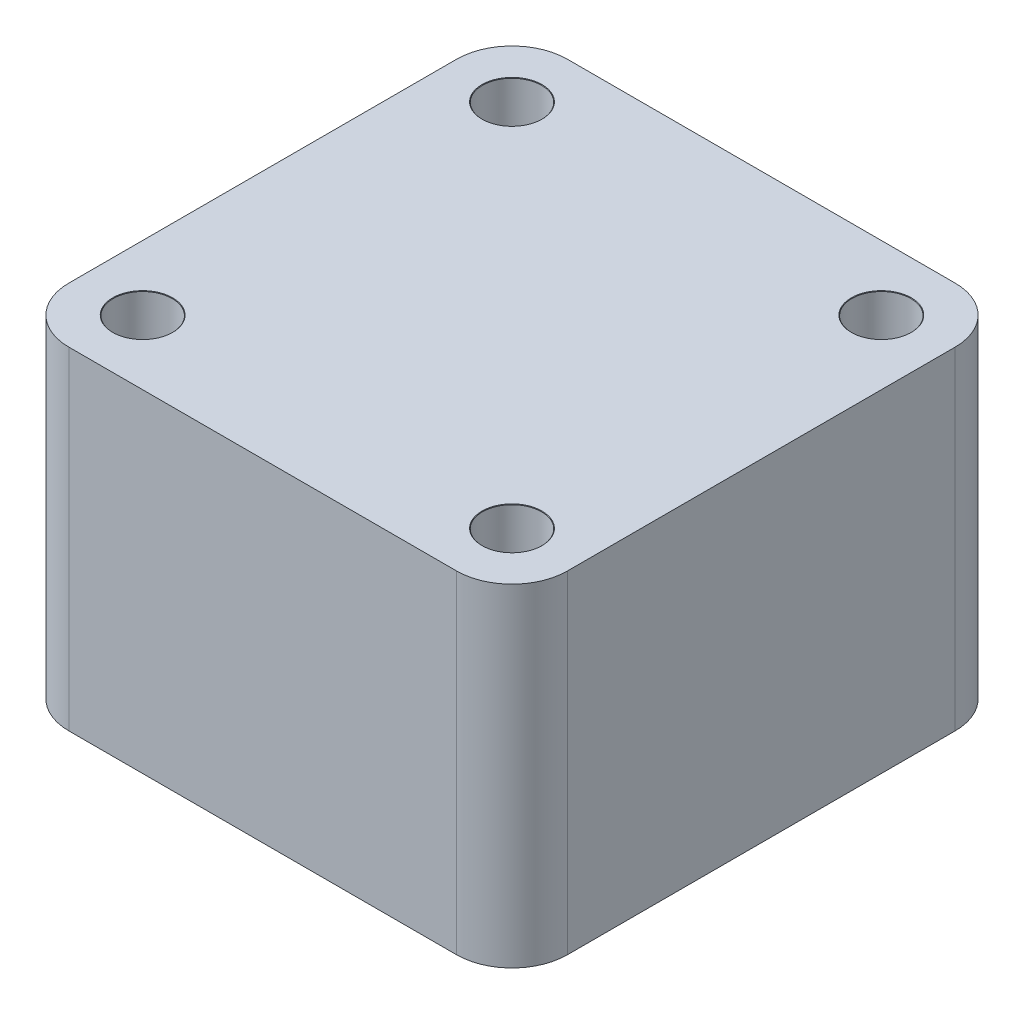
ISO-10303-21;
HEADER;
FILE_DESCRIPTION(('STEP AP214'),'2;1');
FILE_NAME('part.step','',(''),(''),'','','');
FILE_SCHEMA(('AUTOMOTIVE_DESIGN { 1 0 10303 214 1 1 1 1 }'));
ENDSEC;
DATA;
#1=APPLICATION_CONTEXT('core data for automotive mechanical design processes');
#2=APPLICATION_PROTOCOL_DEFINITION('international standard','automotive_design',2000,#1);
#3=PRODUCT_CONTEXT('',#1,'mechanical');
#4=PRODUCT('Part','Part','',(#3));
#5=PRODUCT_RELATED_PRODUCT_CATEGORY('part','',(#4));
#6=PRODUCT_DEFINITION_FORMATION('','',#4);
#7=PRODUCT_DEFINITION_CONTEXT('part definition',#1,'design');
#8=PRODUCT_DEFINITION('design','',#6,#7);
#9=PRODUCT_DEFINITION_SHAPE('','',#8);
#10=(LENGTH_UNIT() NAMED_UNIT(*) SI_UNIT(.MILLI.,.METRE.));
#11=(NAMED_UNIT(*) PLANE_ANGLE_UNIT() SI_UNIT($,.RADIAN.));
#12=(NAMED_UNIT(*) SI_UNIT($,.STERADIAN.) SOLID_ANGLE_UNIT());
#13=UNCERTAINTY_MEASURE_WITH_UNIT(LENGTH_MEASURE(1.E-05),#10,'distance_accuracy_value','');
#14=(GEOMETRIC_REPRESENTATION_CONTEXT(3) GLOBAL_UNCERTAINTY_ASSIGNED_CONTEXT((#13)) GLOBAL_UNIT_ASSIGNED_CONTEXT((#10,
#11,#12)) REPRESENTATION_CONTEXT('',''));
#15=CARTESIAN_POINT('',(0.,0.,0.));
#16=DIRECTION('',(0.,0.,1.));
#17=DIRECTION('',(1.,0.,0.));
#18=AXIS2_PLACEMENT_3D('',#15,#16,#17);
#19=CARTESIAN_POINT('',(-13.5,18.,13.5));
#20=DIRECTION('',(1.,0.,0.));
#21=DIRECTION('',(0.,0.,-1.));
#22=AXIS2_PLACEMENT_3D('',#19,#20,#21);
#23=PLANE('',#22);
#24=DIRECTION('',(0.,0.,1.));
#25=VECTOR('',#24,1.);
#26=CARTESIAN_POINT('',(-13.5,0.,13.5));
#27=LINE('',#26,#25);
#28=CARTESIAN_POINT('',(-13.5,0.,-10.5));
#29=VERTEX_POINT('',#28);
#30=CARTESIAN_POINT('',(-13.5,0.,10.5));
#31=VERTEX_POINT('',#30);
#32=EDGE_CURVE('E142',#29,#31,#27,.T.);
#33=ORIENTED_EDGE('',*,*,#32,.T.);
#34=DIRECTION('',(0.,-1.,0.));
#35=VECTOR('',#34,1.);
#36=CARTESIAN_POINT('',(-13.5,18.,10.5));
#37=LINE('',#36,#35);
#38=CARTESIAN_POINT('',(-13.5,18.,10.5));
#39=VERTEX_POINT('',#38);
#40=EDGE_CURVE('E175',#31,#39,#37,.F.);
#41=ORIENTED_EDGE('',*,*,#40,.T.);
#42=DIRECTION('',(0.,0.,1.));
#43=VECTOR('',#42,1.);
#44=CARTESIAN_POINT('',(-13.5,18.,13.5));
#45=LINE('',#44,#43);
#46=CARTESIAN_POINT('',(-13.5,18.,-10.5));
#47=VERTEX_POINT('',#46);
#48=EDGE_CURVE('E140',#47,#39,#45,.T.);
#49=ORIENTED_EDGE('',*,*,#48,.F.);
#50=DIRECTION('',(0.,-1.,0.));
#51=VECTOR('',#50,1.);
#52=CARTESIAN_POINT('',(-13.5,18.,-10.5));
#53=LINE('',#52,#51);
#54=EDGE_CURVE('E171',#47,#29,#53,.T.);
#55=ORIENTED_EDGE('',*,*,#54,.T.);
#56=EDGE_LOOP('',(#33,#41,#49,#55));
#57=FACE_BOUND('',#56,.T.);
#58=ADVANCED_FACE('F39',(#57),#23,.F.);
#59=CARTESIAN_POINT('',(13.5,18.,13.5));
#60=DIRECTION('',(0.,0.,-1.));
#61=DIRECTION('',(-1.,0.,0.));
#62=AXIS2_PLACEMENT_3D('',#59,#60,#61);
#63=PLANE('',#62);
#64=DIRECTION('',(1.,0.,0.));
#65=VECTOR('',#64,1.);
#66=CARTESIAN_POINT('',(13.5,0.,13.5));
#67=LINE('',#66,#65);
#68=CARTESIAN_POINT('',(-10.5,0.,13.5));
#69=VERTEX_POINT('',#68);
#70=CARTESIAN_POINT('',(10.5,0.,13.5));
#71=VERTEX_POINT('',#70);
#72=EDGE_CURVE('E136',#69,#71,#67,.T.);
#73=ORIENTED_EDGE('',*,*,#72,.T.);
#74=DIRECTION('',(0.,-1.,0.));
#75=VECTOR('',#74,1.);
#76=CARTESIAN_POINT('',(10.5,18.,13.5));
#77=LINE('',#76,#75);
#78=CARTESIAN_POINT('',(10.5,18.,13.5));
#79=VERTEX_POINT('',#78);
#80=EDGE_CURVE('E111',#71,#79,#77,.F.);
#81=ORIENTED_EDGE('',*,*,#80,.T.);
#82=DIRECTION('',(1.,0.,0.));
#83=VECTOR('',#82,1.);
#84=CARTESIAN_POINT('',(13.5,18.,13.5));
#85=LINE('',#84,#83);
#86=CARTESIAN_POINT('',(-10.5,18.,13.5));
#87=VERTEX_POINT('',#86);
#88=EDGE_CURVE('E182',#87,#79,#85,.T.);
#89=ORIENTED_EDGE('',*,*,#88,.F.);
#90=DIRECTION('',(0.,-1.,0.));
#91=VECTOR('',#90,1.);
#92=CARTESIAN_POINT('',(-10.5,18.,13.5));
#93=LINE('',#92,#91);
#94=EDGE_CURVE('E117',#87,#69,#93,.T.);
#95=ORIENTED_EDGE('',*,*,#94,.T.);
#96=EDGE_LOOP('',(#73,#81,#89,#95));
#97=FACE_BOUND('',#96,.T.);
#98=ADVANCED_FACE('F314',(#97),#63,.F.);
#99=CARTESIAN_POINT('',(13.5,18.,13.5));
#100=DIRECTION('',(-1.,0.,0.));
#101=DIRECTION('',(0.,0.,1.));
#102=AXIS2_PLACEMENT_3D('',#99,#100,#101);
#103=PLANE('',#102);
#104=DIRECTION('',(0.,0.,-1.));
#105=VECTOR('',#104,1.);
#106=CARTESIAN_POINT('',(13.5,18.,13.5));
#107=LINE('',#106,#105);
#108=CARTESIAN_POINT('',(13.5,18.,10.5));
#109=VERTEX_POINT('',#108);
#110=CARTESIAN_POINT('',(13.5,18.,-10.5));
#111=VERTEX_POINT('',#110);
#112=EDGE_CURVE('E126',#109,#111,#107,.T.);
#113=ORIENTED_EDGE('',*,*,#112,.F.);
#114=DIRECTION('',(0.,-1.,0.));
#115=VECTOR('',#114,1.);
#116=CARTESIAN_POINT('',(13.5,18.,10.5));
#117=LINE('',#116,#115);
#118=CARTESIAN_POINT('',(13.5,0.,10.5));
#119=VERTEX_POINT('',#118);
#120=EDGE_CURVE('E110',#109,#119,#117,.T.);
#121=ORIENTED_EDGE('',*,*,#120,.T.);
#122=DIRECTION('',(0.,0.,-1.));
#123=VECTOR('',#122,1.);
#124=CARTESIAN_POINT('',(13.5,0.,13.5));
#125=LINE('',#124,#123);
#126=CARTESIAN_POINT('',(13.5,0.,-10.5));
#127=VERTEX_POINT('',#126);
#128=EDGE_CURVE('E124',#119,#127,#125,.T.);
#129=ORIENTED_EDGE('',*,*,#128,.T.);
#130=DIRECTION('',(0.,-1.,0.));
#131=VECTOR('',#130,1.);
#132=CARTESIAN_POINT('',(13.5,18.,-10.5));
#133=LINE('',#132,#131);
#134=EDGE_CURVE('E129',#127,#111,#133,.F.);
#135=ORIENTED_EDGE('',*,*,#134,.T.);
#136=EDGE_LOOP('',(#113,#121,#129,#135));
#137=FACE_BOUND('',#136,.T.);
#138=ADVANCED_FACE('F123',(#137),#103,.F.);
#139=CARTESIAN_POINT('',(13.5,18.,-13.5));
#140=DIRECTION('',(0.,0.,1.));
#141=DIRECTION('',(1.,0.,0.));
#142=AXIS2_PLACEMENT_3D('',#139,#140,#141);
#143=PLANE('',#142);
#144=DIRECTION('',(-1.,0.,0.));
#145=VECTOR('',#144,1.);
#146=CARTESIAN_POINT('',(13.5,18.,-13.5));
#147=LINE('',#146,#145);
#148=CARTESIAN_POINT('',(10.5,18.,-13.5));
#149=VERTEX_POINT('',#148);
#150=CARTESIAN_POINT('',(-10.5,18.,-13.5));
#151=VERTEX_POINT('',#150);
#152=EDGE_CURVE('E147',#149,#151,#147,.T.);
#153=ORIENTED_EDGE('',*,*,#152,.F.);
#154=DIRECTION('',(0.,-1.,0.));
#155=VECTOR('',#154,1.);
#156=CARTESIAN_POINT('',(10.5,18.,-13.5));
#157=LINE('',#156,#155);
#158=CARTESIAN_POINT('',(10.5,0.,-13.5));
#159=VERTEX_POINT('',#158);
#160=EDGE_CURVE('E11',#149,#159,#157,.T.);
#161=ORIENTED_EDGE('',*,*,#160,.T.);
#162=DIRECTION('',(-1.,0.,0.));
#163=VECTOR('',#162,1.);
#164=CARTESIAN_POINT('',(13.5,0.,-13.5));
#165=LINE('',#164,#163);
#166=CARTESIAN_POINT('',(-10.5,0.,-13.5));
#167=VERTEX_POINT('',#166);
#168=EDGE_CURVE('E135',#159,#167,#165,.T.);
#169=ORIENTED_EDGE('',*,*,#168,.T.);
#170=DIRECTION('',(0.,-1.,0.));
#171=VECTOR('',#170,1.);
#172=CARTESIAN_POINT('',(-10.5,18.,-13.5));
#173=LINE('',#172,#171);
#174=EDGE_CURVE('E48',#167,#151,#173,.F.);
#175=ORIENTED_EDGE('',*,*,#174,.T.);
#176=EDGE_LOOP('',(#153,#161,#169,#175));
#177=FACE_BOUND('',#176,.T.);
#178=ADVANCED_FACE('F336',(#177),#143,.F.);
#179=CARTESIAN_POINT('',(0.,18.,0.));
#180=DIRECTION('',(0.,1.,0.));
#181=DIRECTION('',(0.,0.,1.));
#182=AXIS2_PLACEMENT_3D('',#179,#180,#181);
#183=PLANE('',#182);
#184=CARTESIAN_POINT('',(10.,18.,-10.));
#185=DIRECTION('',(0.,-1.,0.));
#186=DIRECTION('',(0.,0.,-1.));
#187=AXIS2_PLACEMENT_3D('',#184,#185,#186);
#188=CIRCLE('',#187,1.625);
#189=CARTESIAN_POINT('',(10.,18.,-11.625));
#190=VERTEX_POINT('',#189);
#191=EDGE_CURVE('E261',#190,#190,#188,.T.);
#192=ORIENTED_EDGE('',*,*,#191,.T.);
#193=EDGE_LOOP('',(#192));
#194=FACE_BOUND('',#193,.T.);
#195=CARTESIAN_POINT('',(-10.,18.,-10.));
#196=DIRECTION('',(0.,-1.,0.));
#197=DIRECTION('',(0.,0.,-1.));
#198=AXIS2_PLACEMENT_3D('',#195,#196,#197);
#199=CIRCLE('',#198,1.625);
#200=CARTESIAN_POINT('',(-10.,18.,-11.625));
#201=VERTEX_POINT('',#200);
#202=EDGE_CURVE('E245',#201,#201,#199,.T.);
#203=ORIENTED_EDGE('',*,*,#202,.T.);
#204=EDGE_LOOP('',(#203));
#205=FACE_BOUND('',#204,.T.);
#206=CARTESIAN_POINT('',(-10.,18.,10.));
#207=DIRECTION('',(0.,-1.,0.));
#208=DIRECTION('',(0.,0.,-1.));
#209=AXIS2_PLACEMENT_3D('',#206,#207,#208);
#210=CIRCLE('',#209,1.625);
#211=CARTESIAN_POINT('',(-10.,18.,8.375));
#212=VERTEX_POINT('',#211);
#213=EDGE_CURVE('E229',#212,#212,#210,.T.);
#214=ORIENTED_EDGE('',*,*,#213,.T.);
#215=EDGE_LOOP('',(#214));
#216=FACE_BOUND('',#215,.T.);
#217=CARTESIAN_POINT('',(10.,18.,10.));
#218=DIRECTION('',(0.,-1.,0.));
#219=DIRECTION('',(0.,0.,-1.));
#220=AXIS2_PLACEMENT_3D('',#217,#218,#219);
#221=CIRCLE('',#220,1.625);
#222=CARTESIAN_POINT('',(10.,18.,8.375));
#223=VERTEX_POINT('',#222);
#224=EDGE_CURVE('E211',#223,#223,#221,.T.);
#225=ORIENTED_EDGE('',*,*,#224,.T.);
#226=EDGE_LOOP('',(#225));
#227=FACE_BOUND('',#226,.T.);
#228=ORIENTED_EDGE('',*,*,#88,.T.);
#229=CARTESIAN_POINT('',(10.5,18.,10.5));
#230=DIRECTION('',(0.,1.,0.));
#231=DIRECTION('',(0.,0.,1.));
#232=AXIS2_PLACEMENT_3D('',#229,#230,#231);
#233=CIRCLE('',#232,3.);
#234=EDGE_CURVE('E168',#79,#109,#233,.T.);
#235=ORIENTED_EDGE('',*,*,#234,.T.);
#236=ORIENTED_EDGE('',*,*,#112,.T.);
#237=CARTESIAN_POINT('',(10.5,18.,-10.5));
#238=DIRECTION('',(0.,1.,0.));
#239=DIRECTION('',(0.,0.,1.));
#240=AXIS2_PLACEMENT_3D('',#237,#238,#239);
#241=CIRCLE('',#240,3.);
#242=EDGE_CURVE('E61',#111,#149,#241,.T.);
#243=ORIENTED_EDGE('',*,*,#242,.T.);
#244=ORIENTED_EDGE('',*,*,#152,.T.);
#245=CARTESIAN_POINT('',(-10.5,18.,-10.5));
#246=DIRECTION('',(0.,1.,0.));
#247=DIRECTION('',(0.,0.,1.));
#248=AXIS2_PLACEMENT_3D('',#245,#246,#247);
#249=CIRCLE('',#248,3.);
#250=EDGE_CURVE('E160',#151,#47,#249,.T.);
#251=ORIENTED_EDGE('',*,*,#250,.T.);
#252=ORIENTED_EDGE('',*,*,#48,.T.);
#253=CARTESIAN_POINT('',(-10.5,18.,10.5));
#254=DIRECTION('',(0.,1.,0.));
#255=DIRECTION('',(0.,0.,1.));
#256=AXIS2_PLACEMENT_3D('',#253,#254,#255);
#257=CIRCLE('',#256,3.);
#258=EDGE_CURVE('E165',#39,#87,#257,.T.);
#259=ORIENTED_EDGE('',*,*,#258,.T.);
#260=EDGE_LOOP('',(#228,#235,#236,#243,#244,#251,#252,#259));
#261=FACE_BOUND('',#260,.T.);
#262=ADVANCED_FACE('F266',(#194,#205,#216,#227,#261),#183,.T.);
#263=CARTESIAN_POINT('',(0.,0.,0.));
#264=DIRECTION('',(0.,1.,0.));
#265=DIRECTION('',(0.,0.,1.));
#266=AXIS2_PLACEMENT_3D('',#263,#264,#265);
#267=PLANE('',#266);
#268=CARTESIAN_POINT('',(10.,0.,-10.));
#269=DIRECTION('',(0.,-1.,0.));
#270=DIRECTION('',(0.,0.,-1.));
#271=AXIS2_PLACEMENT_3D('',#268,#269,#270);
#272=CIRCLE('',#271,1.625);
#273=CARTESIAN_POINT('',(10.,0.,-11.625));
#274=VERTEX_POINT('',#273);
#275=EDGE_CURVE('E257',#274,#274,#272,.T.);
#276=ORIENTED_EDGE('',*,*,#275,.F.);
#277=EDGE_LOOP('',(#276));
#278=FACE_BOUND('',#277,.T.);
#279=CARTESIAN_POINT('',(-10.,0.,-10.));
#280=DIRECTION('',(0.,-1.,0.));
#281=DIRECTION('',(0.,0.,-1.));
#282=AXIS2_PLACEMENT_3D('',#279,#280,#281);
#283=CIRCLE('',#282,1.625);
#284=CARTESIAN_POINT('',(-10.,0.,-11.625));
#285=VERTEX_POINT('',#284);
#286=EDGE_CURVE('E241',#285,#285,#283,.T.);
#287=ORIENTED_EDGE('',*,*,#286,.F.);
#288=EDGE_LOOP('',(#287));
#289=FACE_BOUND('',#288,.T.);
#290=CARTESIAN_POINT('',(-10.,0.,10.));
#291=DIRECTION('',(0.,-1.,0.));
#292=DIRECTION('',(0.,0.,-1.));
#293=AXIS2_PLACEMENT_3D('',#290,#291,#292);
#294=CIRCLE('',#293,1.625);
#295=CARTESIAN_POINT('',(-10.,0.,8.375));
#296=VERTEX_POINT('',#295);
#297=EDGE_CURVE('E225',#296,#296,#294,.T.);
#298=ORIENTED_EDGE('',*,*,#297,.F.);
#299=EDGE_LOOP('',(#298));
#300=FACE_BOUND('',#299,.T.);
#301=CARTESIAN_POINT('',(10.,0.,10.));
#302=DIRECTION('',(0.,-1.,0.));
#303=DIRECTION('',(0.,0.,-1.));
#304=AXIS2_PLACEMENT_3D('',#301,#302,#303);
#305=CIRCLE('',#304,1.625);
#306=CARTESIAN_POINT('',(10.,0.,8.375));
#307=VERTEX_POINT('',#306);
#308=EDGE_CURVE('E206',#307,#307,#305,.T.);
#309=ORIENTED_EDGE('',*,*,#308,.F.);
#310=EDGE_LOOP('',(#309));
#311=FACE_BOUND('',#310,.T.);
#312=ORIENTED_EDGE('',*,*,#128,.F.);
#313=CARTESIAN_POINT('',(10.5,0.,10.5));
#314=DIRECTION('',(0.,1.,0.));
#315=DIRECTION('',(0.,0.,1.));
#316=AXIS2_PLACEMENT_3D('',#313,#314,#315);
#317=CIRCLE('',#316,3.);
#318=EDGE_CURVE('E106',#119,#71,#317,.F.);
#319=ORIENTED_EDGE('',*,*,#318,.T.);
#320=ORIENTED_EDGE('',*,*,#72,.F.);
#321=CARTESIAN_POINT('',(-10.5,0.,10.5));
#322=DIRECTION('',(0.,1.,0.));
#323=DIRECTION('',(0.,0.,1.));
#324=AXIS2_PLACEMENT_3D('',#321,#322,#323);
#325=CIRCLE('',#324,3.);
#326=EDGE_CURVE('E118',#69,#31,#325,.F.);
#327=ORIENTED_EDGE('',*,*,#326,.T.);
#328=ORIENTED_EDGE('',*,*,#32,.F.);
#329=CARTESIAN_POINT('',(-10.5,0.,-10.5));
#330=DIRECTION('',(0.,1.,0.));
#331=DIRECTION('',(0.,0.,1.));
#332=AXIS2_PLACEMENT_3D('',#329,#330,#331);
#333=CIRCLE('',#332,3.);
#334=EDGE_CURVE('E128',#29,#167,#333,.F.);
#335=ORIENTED_EDGE('',*,*,#334,.T.);
#336=ORIENTED_EDGE('',*,*,#168,.F.);
#337=CARTESIAN_POINT('',(10.5,0.,-10.5));
#338=DIRECTION('',(0.,1.,0.));
#339=DIRECTION('',(0.,0.,1.));
#340=AXIS2_PLACEMENT_3D('',#337,#338,#339);
#341=CIRCLE('',#340,3.);
#342=EDGE_CURVE('E133',#159,#127,#341,.F.);
#343=ORIENTED_EDGE('',*,*,#342,.T.);
#344=EDGE_LOOP('',(#312,#319,#320,#327,#328,#335,#336,#343));
#345=FACE_BOUND('',#344,.T.);
#346=ADVANCED_FACE('F131',(#278,#289,#300,#311,#345),#267,.F.);
#347=CARTESIAN_POINT('',(10.,17.975,10.));
#348=DIRECTION('',(0.,1.,0.));
#349=DIRECTION('',(0.,0.,1.));
#350=AXIS2_PLACEMENT_3D('',#347,#348,#349);
#351=CONICAL_SURFACE('',#350,1.6,0.785398163397448);
#352=ORIENTED_EDGE('',*,*,#224,.F.);
#353=EDGE_LOOP('',(#352));
#354=FACE_BOUND('',#353,.T.);
#355=CARTESIAN_POINT('',(10.,17.975,10.));
#356=DIRECTION('',(0.,-1.,0.));
#357=DIRECTION('',(0.,0.,-1.));
#358=AXIS2_PLACEMENT_3D('',#355,#356,#357);
#359=CIRCLE('',#358,1.6);
#360=CARTESIAN_POINT('',(10.,17.975,8.4));
#361=VERTEX_POINT('',#360);
#362=EDGE_CURVE('E192',#361,#361,#359,.T.);
#363=ORIENTED_EDGE('',*,*,#362,.T.);
#364=EDGE_LOOP('',(#363));
#365=FACE_BOUND('',#364,.T.);
#366=ADVANCED_FACE('F290',(#354,#365),#351,.F.);
#367=CARTESIAN_POINT('',(10.,0.,10.));
#368=DIRECTION('',(0.,-1.,0.));
#369=DIRECTION('',(0.,0.,-1.));
#370=AXIS2_PLACEMENT_3D('',#367,#368,#369);
#371=CYLINDRICAL_SURFACE('',#370,1.6);
#372=ORIENTED_EDGE('',*,*,#362,.F.);
#373=EDGE_LOOP('',(#372));
#374=FACE_BOUND('',#373,.T.);
#375=CARTESIAN_POINT('',(10.,0.0250000000000007,10.));
#376=DIRECTION('',(0.,-1.,0.));
#377=DIRECTION('',(0.,0.,-1.));
#378=AXIS2_PLACEMENT_3D('',#375,#376,#377);
#379=CIRCLE('',#378,1.6);
#380=CARTESIAN_POINT('',(10.,0.0250000000000007,8.4));
#381=VERTEX_POINT('',#380);
#382=EDGE_CURVE('E201',#381,#381,#379,.T.);
#383=ORIENTED_EDGE('',*,*,#382,.T.);
#384=EDGE_LOOP('',(#383));
#385=FACE_BOUND('',#384,.T.);
#386=ADVANCED_FACE('F301',(#374,#385),#371,.F.);
#387=CARTESIAN_POINT('',(10.,0.,10.));
#388=DIRECTION('',(0.,-1.,0.));
#389=DIRECTION('',(0.,0.,-1.));
#390=AXIS2_PLACEMENT_3D('',#387,#388,#389);
#391=CONICAL_SURFACE('',#390,1.625,0.785398163397483);
#392=ORIENTED_EDGE('',*,*,#382,.F.);
#393=EDGE_LOOP('',(#392));
#394=FACE_BOUND('',#393,.T.);
#395=ORIENTED_EDGE('',*,*,#308,.T.);
#396=EDGE_LOOP('',(#395));
#397=FACE_BOUND('',#396,.T.);
#398=ADVANCED_FACE('F298',(#394,#397),#391,.F.);
#399=CARTESIAN_POINT('',(-10.,17.975,10.));
#400=DIRECTION('',(0.,1.,0.));
#401=DIRECTION('',(0.,0.,1.));
#402=AXIS2_PLACEMENT_3D('',#399,#400,#401);
#403=CONICAL_SURFACE('',#402,1.6,0.785398163397448);
#404=ORIENTED_EDGE('',*,*,#213,.F.);
#405=EDGE_LOOP('',(#404));
#406=FACE_BOUND('',#405,.T.);
#407=CARTESIAN_POINT('',(-10.,17.975,10.));
#408=DIRECTION('',(0.,-1.,0.));
#409=DIRECTION('',(0.,0.,-1.));
#410=AXIS2_PLACEMENT_3D('',#407,#408,#409);
#411=CIRCLE('',#410,1.6);
#412=CARTESIAN_POINT('',(-10.,17.975,8.4));
#413=VERTEX_POINT('',#412);
#414=EDGE_CURVE('E217',#413,#413,#411,.T.);
#415=ORIENTED_EDGE('',*,*,#414,.T.);
#416=EDGE_LOOP('',(#415));
#417=FACE_BOUND('',#416,.T.);
#418=ADVANCED_FACE('F300',(#406,#417),#403,.F.);
#419=CARTESIAN_POINT('',(-10.,0.,10.));
#420=DIRECTION('',(0.,-1.,0.));
#421=DIRECTION('',(0.,0.,-1.));
#422=AXIS2_PLACEMENT_3D('',#419,#420,#421);
#423=CYLINDRICAL_SURFACE('',#422,1.6);
#424=ORIENTED_EDGE('',*,*,#414,.F.);
#425=EDGE_LOOP('',(#424));
#426=FACE_BOUND('',#425,.T.);
#427=CARTESIAN_POINT('',(-10.,0.0250000000000007,10.));
#428=DIRECTION('',(0.,-1.,0.));
#429=DIRECTION('',(0.,0.,-1.));
#430=AXIS2_PLACEMENT_3D('',#427,#428,#429);
#431=CIRCLE('',#430,1.6);
#432=CARTESIAN_POINT('',(-10.,0.0250000000000007,8.4));
#433=VERTEX_POINT('',#432);
#434=EDGE_CURVE('E221',#433,#433,#431,.T.);
#435=ORIENTED_EDGE('',*,*,#434,.T.);
#436=EDGE_LOOP('',(#435));
#437=FACE_BOUND('',#436,.T.);
#438=ADVANCED_FACE('F308',(#426,#437),#423,.F.);
#439=CARTESIAN_POINT('',(-10.,0.,10.));
#440=DIRECTION('',(0.,-1.,0.));
#441=DIRECTION('',(0.,0.,-1.));
#442=AXIS2_PLACEMENT_3D('',#439,#440,#441);
#443=CONICAL_SURFACE('',#442,1.625,0.785398163397483);
#444=ORIENTED_EDGE('',*,*,#434,.F.);
#445=EDGE_LOOP('',(#444));
#446=FACE_BOUND('',#445,.T.);
#447=ORIENTED_EDGE('',*,*,#297,.T.);
#448=EDGE_LOOP('',(#447));
#449=FACE_BOUND('',#448,.T.);
#450=ADVANCED_FACE('F427',(#446,#449),#443,.F.);
#451=CARTESIAN_POINT('',(-10.,17.975,-10.));
#452=DIRECTION('',(0.,1.,0.));
#453=DIRECTION('',(0.,0.,1.));
#454=AXIS2_PLACEMENT_3D('',#451,#452,#453);
#455=CONICAL_SURFACE('',#454,1.6,0.785398163397448);
#456=ORIENTED_EDGE('',*,*,#202,.F.);
#457=EDGE_LOOP('',(#456));
#458=FACE_BOUND('',#457,.T.);
#459=CARTESIAN_POINT('',(-10.,17.975,-10.));
#460=DIRECTION('',(0.,-1.,0.));
#461=DIRECTION('',(0.,0.,-1.));
#462=AXIS2_PLACEMENT_3D('',#459,#460,#461);
#463=CIRCLE('',#462,1.6);
#464=CARTESIAN_POINT('',(-10.,17.975,-11.6));
#465=VERTEX_POINT('',#464);
#466=EDGE_CURVE('E233',#465,#465,#463,.T.);
#467=ORIENTED_EDGE('',*,*,#466,.T.);
#468=EDGE_LOOP('',(#467));
#469=FACE_BOUND('',#468,.T.);
#470=ADVANCED_FACE('F419',(#458,#469),#455,.F.);
#471=CARTESIAN_POINT('',(-10.,0.,-10.));
#472=DIRECTION('',(0.,-1.,0.));
#473=DIRECTION('',(0.,0.,-1.));
#474=AXIS2_PLACEMENT_3D('',#471,#472,#473);
#475=CYLINDRICAL_SURFACE('',#474,1.6);
#476=ORIENTED_EDGE('',*,*,#466,.F.);
#477=EDGE_LOOP('',(#476));
#478=FACE_BOUND('',#477,.T.);
#479=CARTESIAN_POINT('',(-10.,0.0250000000000007,-10.));
#480=DIRECTION('',(0.,-1.,0.));
#481=DIRECTION('',(0.,0.,-1.));
#482=AXIS2_PLACEMENT_3D('',#479,#480,#481);
#483=CIRCLE('',#482,1.6);
#484=CARTESIAN_POINT('',(-10.,0.0250000000000007,-11.6));
#485=VERTEX_POINT('',#484);
#486=EDGE_CURVE('E237',#485,#485,#483,.T.);
#487=ORIENTED_EDGE('',*,*,#486,.T.);
#488=EDGE_LOOP('',(#487));
#489=FACE_BOUND('',#488,.T.);
#490=ADVANCED_FACE('F411',(#478,#489),#475,.F.);
#491=CARTESIAN_POINT('',(-10.,0.,-10.));
#492=DIRECTION('',(0.,-1.,0.));
#493=DIRECTION('',(0.,0.,-1.));
#494=AXIS2_PLACEMENT_3D('',#491,#492,#493);
#495=CONICAL_SURFACE('',#494,1.625,0.785398163397483);
#496=ORIENTED_EDGE('',*,*,#486,.F.);
#497=EDGE_LOOP('',(#496));
#498=FACE_BOUND('',#497,.T.);
#499=ORIENTED_EDGE('',*,*,#286,.T.);
#500=EDGE_LOOP('',(#499));
#501=FACE_BOUND('',#500,.T.);
#502=ADVANCED_FACE('F273',(#498,#501),#495,.F.);
#503=CARTESIAN_POINT('',(10.,17.975,-10.));
#504=DIRECTION('',(0.,1.,0.));
#505=DIRECTION('',(0.,0.,1.));
#506=AXIS2_PLACEMENT_3D('',#503,#504,#505);
#507=CONICAL_SURFACE('',#506,1.6,0.785398163397448);
#508=ORIENTED_EDGE('',*,*,#191,.F.);
#509=EDGE_LOOP('',(#508));
#510=FACE_BOUND('',#509,.T.);
#511=CARTESIAN_POINT('',(10.,17.975,-10.));
#512=DIRECTION('',(0.,-1.,0.));
#513=DIRECTION('',(0.,0.,-1.));
#514=AXIS2_PLACEMENT_3D('',#511,#512,#513);
#515=CIRCLE('',#514,1.6);
#516=CARTESIAN_POINT('',(10.,17.975,-11.6));
#517=VERTEX_POINT('',#516);
#518=EDGE_CURVE('E249',#517,#517,#515,.T.);
#519=ORIENTED_EDGE('',*,*,#518,.T.);
#520=EDGE_LOOP('',(#519));
#521=FACE_BOUND('',#520,.T.);
#522=ADVANCED_FACE('F269',(#510,#521),#507,.F.);
#523=CARTESIAN_POINT('',(10.,0.,-10.));
#524=DIRECTION('',(0.,-1.,0.));
#525=DIRECTION('',(0.,0.,-1.));
#526=AXIS2_PLACEMENT_3D('',#523,#524,#525);
#527=CYLINDRICAL_SURFACE('',#526,1.6);
#528=ORIENTED_EDGE('',*,*,#518,.F.);
#529=EDGE_LOOP('',(#528));
#530=FACE_BOUND('',#529,.T.);
#531=CARTESIAN_POINT('',(10.,0.0250000000000007,-10.));
#532=DIRECTION('',(0.,-1.,0.));
#533=DIRECTION('',(0.,0.,-1.));
#534=AXIS2_PLACEMENT_3D('',#531,#532,#533);
#535=CIRCLE('',#534,1.6);
#536=CARTESIAN_POINT('',(10.,0.0250000000000007,-11.6));
#537=VERTEX_POINT('',#536);
#538=EDGE_CURVE('E253',#537,#537,#535,.T.);
#539=ORIENTED_EDGE('',*,*,#538,.T.);
#540=EDGE_LOOP('',(#539));
#541=FACE_BOUND('',#540,.T.);
#542=ADVANCED_FACE('F272',(#530,#541),#527,.F.);
#543=CARTESIAN_POINT('',(10.,0.,-10.));
#544=DIRECTION('',(0.,-1.,0.));
#545=DIRECTION('',(0.,0.,-1.));
#546=AXIS2_PLACEMENT_3D('',#543,#544,#545);
#547=CONICAL_SURFACE('',#546,1.625,0.785398163397483);
#548=ORIENTED_EDGE('',*,*,#538,.F.);
#549=EDGE_LOOP('',(#548));
#550=FACE_BOUND('',#549,.T.);
#551=ORIENTED_EDGE('',*,*,#275,.T.);
#552=EDGE_LOOP('',(#551));
#553=FACE_BOUND('',#552,.T.);
#554=ADVANCED_FACE('F279',(#550,#553),#547,.F.);
#555=CARTESIAN_POINT('',(10.5,18.,10.5));
#556=DIRECTION('',(0.,-1.,0.));
#557=DIRECTION('',(0.,0.,-1.));
#558=AXIS2_PLACEMENT_3D('',#555,#556,#557);
#559=CYLINDRICAL_SURFACE('',#558,3.);
#560=ORIENTED_EDGE('',*,*,#234,.F.);
#561=ORIENTED_EDGE('',*,*,#80,.F.);
#562=ORIENTED_EDGE('',*,*,#318,.F.);
#563=ORIENTED_EDGE('',*,*,#120,.F.);
#564=EDGE_LOOP('',(#560,#561,#562,#563));
#565=FACE_BOUND('',#564,.T.);
#566=ADVANCED_FACE('F109',(#565),#559,.T.);
#567=CARTESIAN_POINT('',(-10.5,18.,10.5));
#568=DIRECTION('',(0.,-1.,0.));
#569=DIRECTION('',(0.,0.,-1.));
#570=AXIS2_PLACEMENT_3D('',#567,#568,#569);
#571=CYLINDRICAL_SURFACE('',#570,3.);
#572=ORIENTED_EDGE('',*,*,#258,.F.);
#573=ORIENTED_EDGE('',*,*,#40,.F.);
#574=ORIENTED_EDGE('',*,*,#326,.F.);
#575=ORIENTED_EDGE('',*,*,#94,.F.);
#576=EDGE_LOOP('',(#572,#573,#574,#575));
#577=FACE_BOUND('',#576,.T.);
#578=ADVANCED_FACE('F325',(#577),#571,.T.);
#579=CARTESIAN_POINT('',(10.5,18.,-10.5));
#580=DIRECTION('',(0.,-1.,0.));
#581=DIRECTION('',(0.,0.,-1.));
#582=AXIS2_PLACEMENT_3D('',#579,#580,#581);
#583=CYLINDRICAL_SURFACE('',#582,3.);
#584=ORIENTED_EDGE('',*,*,#242,.F.);
#585=ORIENTED_EDGE('',*,*,#134,.F.);
#586=ORIENTED_EDGE('',*,*,#342,.F.);
#587=ORIENTED_EDGE('',*,*,#160,.F.);
#588=EDGE_LOOP('',(#584,#585,#586,#587));
#589=FACE_BOUND('',#588,.T.);
#590=ADVANCED_FACE('F327',(#589),#583,.T.);
#591=CARTESIAN_POINT('',(-10.5,18.,-10.5));
#592=DIRECTION('',(0.,-1.,0.));
#593=DIRECTION('',(0.,0.,-1.));
#594=AXIS2_PLACEMENT_3D('',#591,#592,#593);
#595=CYLINDRICAL_SURFACE('',#594,3.);
#596=ORIENTED_EDGE('',*,*,#250,.F.);
#597=ORIENTED_EDGE('',*,*,#174,.F.);
#598=ORIENTED_EDGE('',*,*,#334,.F.);
#599=ORIENTED_EDGE('',*,*,#54,.F.);
#600=EDGE_LOOP('',(#596,#597,#598,#599));
#601=FACE_BOUND('',#600,.T.);
#602=ADVANCED_FACE('F41',(#601),#595,.T.);
#603=CLOSED_SHELL('',(#58,#98,#138,#178,#262,#346,#366,#386,#398,#418,#438,#450,#470,#490,#502,
#522,#542,#554,#566,#578,#590,#602));
#604=MANIFOLD_SOLID_BREP('B2',#603);
#605=ADVANCED_BREP_SHAPE_REPRESENTATION('',(#18,#604),#14);
#606=SHAPE_DEFINITION_REPRESENTATION(#9,#605);
ENDSEC;
END-ISO-10303-21;
